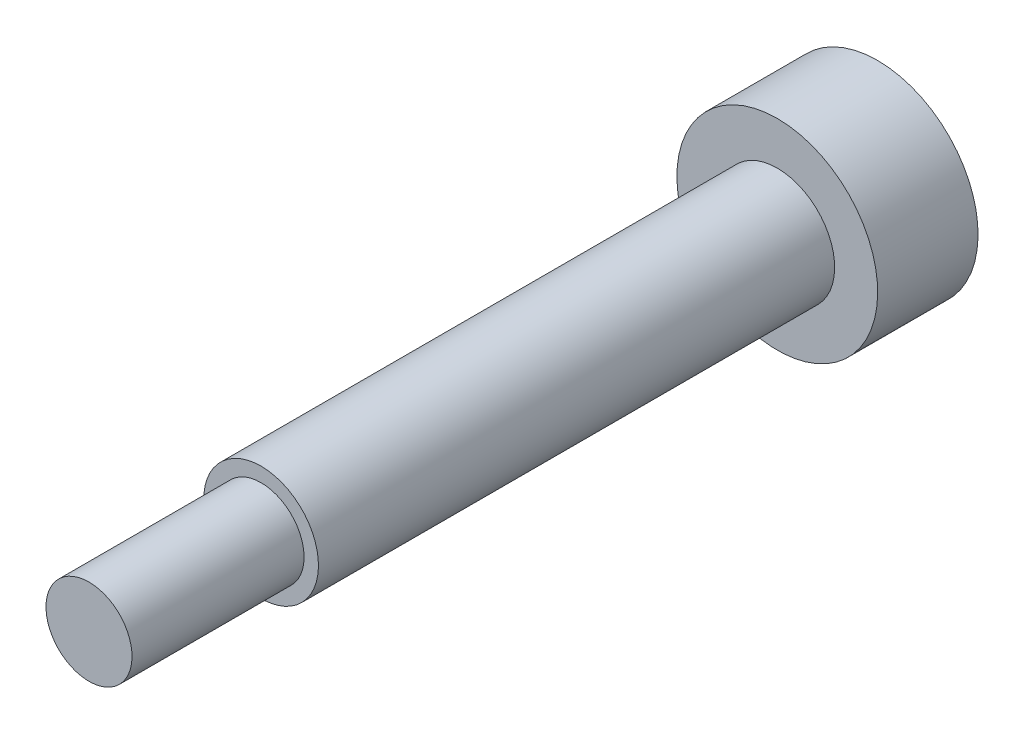
ISO-10303-21;
HEADER;
FILE_DESCRIPTION(('STEP AP214'),'2;1');
FILE_NAME('part.step','',(''),(''),'','','');
FILE_SCHEMA(('AUTOMOTIVE_DESIGN { 1 0 10303 214 1 1 1 1 }'));
ENDSEC;
DATA;
#1=APPLICATION_CONTEXT('core data for automotive mechanical design processes');
#2=APPLICATION_PROTOCOL_DEFINITION('international standard','automotive_design',2000,#1);
#3=PRODUCT_CONTEXT('',#1,'mechanical');
#4=PRODUCT('Part','Part','',(#3));
#5=PRODUCT_RELATED_PRODUCT_CATEGORY('part','',(#4));
#6=PRODUCT_DEFINITION_FORMATION('','',#4);
#7=PRODUCT_DEFINITION_CONTEXT('part definition',#1,'design');
#8=PRODUCT_DEFINITION('design','',#6,#7);
#9=PRODUCT_DEFINITION_SHAPE('','',#8);
#10=(LENGTH_UNIT() NAMED_UNIT(*) SI_UNIT(.MILLI.,.METRE.));
#11=(NAMED_UNIT(*) PLANE_ANGLE_UNIT() SI_UNIT($,.RADIAN.));
#12=(NAMED_UNIT(*) SI_UNIT($,.STERADIAN.) SOLID_ANGLE_UNIT());
#13=UNCERTAINTY_MEASURE_WITH_UNIT(LENGTH_MEASURE(1.E-05),#10,'distance_accuracy_value','');
#14=(GEOMETRIC_REPRESENTATION_CONTEXT(3) GLOBAL_UNCERTAINTY_ASSIGNED_CONTEXT((#13)) GLOBAL_UNIT_ASSIGNED_CONTEXT((#10,
#11,#12)) REPRESENTATION_CONTEXT('',''));
#15=CARTESIAN_POINT('',(0.,0.,0.));
#16=DIRECTION('',(0.,0.,1.));
#17=DIRECTION('',(1.,0.,0.));
#18=AXIS2_PLACEMENT_3D('',#15,#16,#17);
#19=CARTESIAN_POINT('',(0.,0.,0.));
#20=DIRECTION('',(0.,0.,1.));
#21=DIRECTION('',(0.,-1.,0.));
#22=AXIS2_PLACEMENT_3D('',#19,#20,#21);
#23=PLANE('',#22);
#24=CARTESIAN_POINT('',(0.,0.,0.));
#25=DIRECTION('',(0.,0.,-1.));
#26=DIRECTION('',(0.,1.,0.));
#27=AXIS2_PLACEMENT_3D('',#24,#25,#26);
#28=CIRCLE('',#27,1.5);
#29=CARTESIAN_POINT('',(0.,1.5,0.));
#30=VERTEX_POINT('',#29);
#31=EDGE_CURVE('E10',#30,#30,#28,.T.);
#32=ORIENTED_EDGE('',*,*,#31,.F.);
#33=EDGE_LOOP('',(#32));
#34=FACE_BOUND('',#33,.T.);
#35=ADVANCED_FACE('F37',(#34),#23,.T.);
#36=CARTESIAN_POINT('',(0.,0.,-27.5));
#37=DIRECTION('',(0.,0.,-1.));
#38=DIRECTION('',(0.,1.,0.));
#39=AXIS2_PLACEMENT_3D('',#36,#37,#38);
#40=CYLINDRICAL_SURFACE('',#39,1.5);
#41=ORIENTED_EDGE('',*,*,#31,.T.);
#42=EDGE_LOOP('',(#41));
#43=FACE_BOUND('',#42,.T.);
#44=CARTESIAN_POINT('',(0.,0.,-6.));
#45=DIRECTION('',(0.,0.,-1.));
#46=DIRECTION('',(0.,1.,0.));
#47=AXIS2_PLACEMENT_3D('',#44,#45,#46);
#48=CIRCLE('',#47,1.5);
#49=CARTESIAN_POINT('',(0.,1.5,-6.));
#50=VERTEX_POINT('',#49);
#51=EDGE_CURVE('E43',#50,#50,#48,.T.);
#52=ORIENTED_EDGE('',*,*,#51,.F.);
#53=EDGE_LOOP('',(#52));
#54=FACE_BOUND('',#53,.T.);
#55=ADVANCED_FACE('F79',(#43,#54),#40,.T.);
#56=CARTESIAN_POINT('',(0.,1.5,-6.));
#57=DIRECTION('',(0.,0.,1.));
#58=DIRECTION('',(0.,-1.,0.));
#59=AXIS2_PLACEMENT_3D('',#56,#57,#58);
#60=PLANE('',#59);
#61=ORIENTED_EDGE('',*,*,#51,.T.);
#62=EDGE_LOOP('',(#61));
#63=FACE_BOUND('',#62,.T.);
#64=CARTESIAN_POINT('',(0.,0.,-6.));
#65=DIRECTION('',(0.,0.,-1.));
#66=DIRECTION('',(0.,1.,0.));
#67=AXIS2_PLACEMENT_3D('',#64,#65,#66);
#68=CIRCLE('',#67,2.);
#69=CARTESIAN_POINT('',(0.,2.,-6.));
#70=VERTEX_POINT('',#69);
#71=EDGE_CURVE('E47',#70,#70,#68,.T.);
#72=ORIENTED_EDGE('',*,*,#71,.F.);
#73=EDGE_LOOP('',(#72));
#74=FACE_BOUND('',#73,.T.);
#75=ADVANCED_FACE('F84',(#63,#74),#60,.T.);
#76=CARTESIAN_POINT('',(0.,0.,-27.5));
#77=DIRECTION('',(0.,0.,-1.));
#78=DIRECTION('',(0.,1.,0.));
#79=AXIS2_PLACEMENT_3D('',#76,#77,#78);
#80=CYLINDRICAL_SURFACE('',#79,2.);
#81=ORIENTED_EDGE('',*,*,#71,.T.);
#82=EDGE_LOOP('',(#81));
#83=FACE_BOUND('',#82,.T.);
#84=CARTESIAN_POINT('',(0.,0.,-24.));
#85=DIRECTION('',(0.,0.,-1.));
#86=DIRECTION('',(0.,1.,0.));
#87=AXIS2_PLACEMENT_3D('',#84,#85,#86);
#88=CIRCLE('',#87,2.);
#89=CARTESIAN_POINT('',(0.,2.,-24.));
#90=VERTEX_POINT('',#89);
#91=EDGE_CURVE('E51',#90,#90,#88,.T.);
#92=ORIENTED_EDGE('',*,*,#91,.F.);
#93=EDGE_LOOP('',(#92));
#94=FACE_BOUND('',#93,.T.);
#95=ADVANCED_FACE('F75',(#83,#94),#80,.T.);
#96=CARTESIAN_POINT('',(0.,2.,-24.));
#97=DIRECTION('',(0.,0.,1.));
#98=DIRECTION('',(0.,-1.,0.));
#99=AXIS2_PLACEMENT_3D('',#96,#97,#98);
#100=PLANE('',#99);
#101=ORIENTED_EDGE('',*,*,#91,.T.);
#102=EDGE_LOOP('',(#101));
#103=FACE_BOUND('',#102,.T.);
#104=CARTESIAN_POINT('',(0.,0.,-24.));
#105=DIRECTION('',(0.,0.,-1.));
#106=DIRECTION('',(0.,1.,0.));
#107=AXIS2_PLACEMENT_3D('',#104,#105,#106);
#108=CIRCLE('',#107,3.5);
#109=CARTESIAN_POINT('',(0.,3.5,-24.));
#110=VERTEX_POINT('',#109);
#111=EDGE_CURVE('E56',#110,#110,#108,.T.);
#112=ORIENTED_EDGE('',*,*,#111,.F.);
#113=EDGE_LOOP('',(#112));
#114=FACE_BOUND('',#113,.T.);
#115=ADVANCED_FACE('F67',(#103,#114),#100,.T.);
#116=CARTESIAN_POINT('',(0.,0.,-27.5));
#117=DIRECTION('',(0.,0.,-1.));
#118=DIRECTION('',(0.,1.,0.));
#119=AXIS2_PLACEMENT_3D('',#116,#117,#118);
#120=CYLINDRICAL_SURFACE('',#119,3.5);
#121=ORIENTED_EDGE('',*,*,#111,.T.);
#122=EDGE_LOOP('',(#121));
#123=FACE_BOUND('',#122,.T.);
#124=CARTESIAN_POINT('',(0.,0.,-27.5));
#125=DIRECTION('',(0.,0.,-1.));
#126=DIRECTION('',(0.,1.,0.));
#127=AXIS2_PLACEMENT_3D('',#124,#125,#126);
#128=CIRCLE('',#127,3.5);
#129=CARTESIAN_POINT('',(0.,3.5,-27.5));
#130=VERTEX_POINT('',#129);
#131=EDGE_CURVE('E59',#130,#130,#128,.T.);
#132=ORIENTED_EDGE('',*,*,#131,.F.);
#133=EDGE_LOOP('',(#132));
#134=FACE_BOUND('',#133,.T.);
#135=ADVANCED_FACE('F65',(#123,#134),#120,.T.);
#136=CARTESIAN_POINT('',(0.,3.5,-27.5));
#137=DIRECTION('',(0.,0.,-1.));
#138=DIRECTION('',(0.,1.,0.));
#139=AXIS2_PLACEMENT_3D('',#136,#137,#138);
#140=PLANE('',#139);
#141=ORIENTED_EDGE('',*,*,#131,.T.);
#142=EDGE_LOOP('',(#141));
#143=FACE_BOUND('',#142,.T.);
#144=ADVANCED_FACE('F63',(#143),#140,.T.);
#145=CLOSED_SHELL('',(#35,#55,#75,#95,#115,#135,#144));
#146=MANIFOLD_SOLID_BREP('B2',#145);
#147=ADVANCED_BREP_SHAPE_REPRESENTATION('',(#18,#146),#14);
#148=SHAPE_DEFINITION_REPRESENTATION(#9,#147);
ENDSEC;
END-ISO-10303-21;
